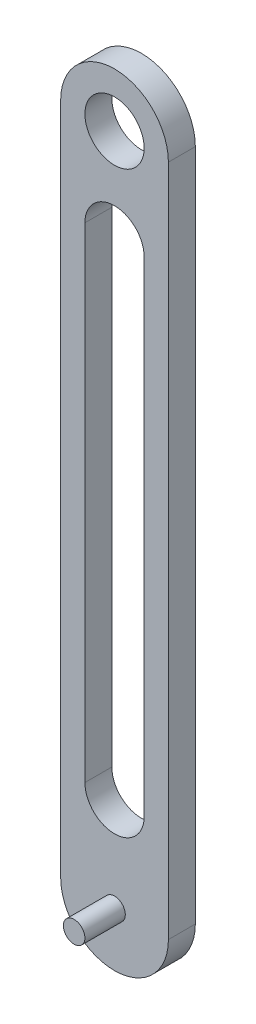
ISO-10303-21;
HEADER;
FILE_DESCRIPTION(('STEP AP214'),'2;1');
FILE_NAME('part.step','',(''),(''),'','','');
FILE_SCHEMA(('AUTOMOTIVE_DESIGN { 1 0 10303 214 1 1 1 1 }'));
ENDSEC;
DATA;
#1=APPLICATION_CONTEXT('core data for automotive mechanical design processes');
#2=APPLICATION_PROTOCOL_DEFINITION('international standard','automotive_design',2000,#1);
#3=PRODUCT_CONTEXT('',#1,'mechanical');
#4=PRODUCT('Part','Part','',(#3));
#5=PRODUCT_RELATED_PRODUCT_CATEGORY('part','',(#4));
#6=PRODUCT_DEFINITION_FORMATION('','',#4);
#7=PRODUCT_DEFINITION_CONTEXT('part definition',#1,'design');
#8=PRODUCT_DEFINITION('design','',#6,#7);
#9=PRODUCT_DEFINITION_SHAPE('','',#8);
#10=(LENGTH_UNIT() NAMED_UNIT(*) SI_UNIT(.MILLI.,.METRE.));
#11=(NAMED_UNIT(*) PLANE_ANGLE_UNIT() SI_UNIT($,.RADIAN.));
#12=(NAMED_UNIT(*) SI_UNIT($,.STERADIAN.) SOLID_ANGLE_UNIT());
#13=UNCERTAINTY_MEASURE_WITH_UNIT(LENGTH_MEASURE(1.E-05),#10,'distance_accuracy_value','');
#14=(GEOMETRIC_REPRESENTATION_CONTEXT(3) GLOBAL_UNCERTAINTY_ASSIGNED_CONTEXT((#13)) GLOBAL_UNIT_ASSIGNED_CONTEXT((#10,
#11,#12)) REPRESENTATION_CONTEXT('',''));
#15=CARTESIAN_POINT('',(0.,0.,0.));
#16=DIRECTION('',(0.,0.,1.));
#17=DIRECTION('',(1.,0.,0.));
#18=AXIS2_PLACEMENT_3D('',#15,#16,#17);
#19=CARTESIAN_POINT('',(-11.,0.,10.));
#20=DIRECTION('',(1.,0.,0.));
#21=DIRECTION('',(0.,1.,0.));
#22=AXIS2_PLACEMENT_3D('',#19,#20,#21);
#23=PLANE('',#22);
#24=DIRECTION('',(0.,-1.,0.));
#25=VECTOR('',#24,1.);
#26=CARTESIAN_POINT('',(-11.,0.,0.));
#27=LINE('',#26,#25);
#28=CARTESIAN_POINT('',(-11.,89.9999999999998,0.));
#29=VERTEX_POINT('',#28);
#30=CARTESIAN_POINT('',(-11.,-90.0000000000002,0.));
#31=VERTEX_POINT('',#30);
#32=EDGE_CURVE('E170',#29,#31,#27,.T.);
#33=ORIENTED_EDGE('',*,*,#32,.F.);
#34=DIRECTION('',(0.,0.,-1.));
#35=VECTOR('',#34,1.);
#36=CARTESIAN_POINT('',(-11.,89.9999999999998,10.));
#37=LINE('',#36,#35);
#38=CARTESIAN_POINT('',(-11.,89.9999999999998,10.));
#39=VERTEX_POINT('',#38);
#40=EDGE_CURVE('E11',#39,#29,#37,.T.);
#41=ORIENTED_EDGE('',*,*,#40,.F.);
#42=DIRECTION('',(0.,-1.,0.));
#43=VECTOR('',#42,1.);
#44=CARTESIAN_POINT('',(-11.,0.,10.));
#45=LINE('',#44,#43);
#46=CARTESIAN_POINT('',(-11.,-90.0000000000002,10.));
#47=VERTEX_POINT('',#46);
#48=EDGE_CURVE('E131',#39,#47,#45,.T.);
#49=ORIENTED_EDGE('',*,*,#48,.T.);
#50=DIRECTION('',(0.,0.,-1.));
#51=VECTOR('',#50,1.);
#52=CARTESIAN_POINT('',(-11.,-90.0000000000002,10.));
#53=LINE('',#52,#51);
#54=EDGE_CURVE('E63',#47,#31,#53,.T.);
#55=ORIENTED_EDGE('',*,*,#54,.T.);
#56=EDGE_LOOP('',(#33,#41,#49,#55));
#57=FACE_BOUND('',#56,.T.);
#58=ADVANCED_FACE('F43',(#57),#23,.T.);
#59=CARTESIAN_POINT('',(0.,89.9999999999998,10.));
#60=DIRECTION('',(0.,0.,-1.));
#61=DIRECTION('',(-1.,0.,0.));
#62=AXIS2_PLACEMENT_3D('',#59,#60,#61);
#63=CYLINDRICAL_SURFACE('',#62,11.);
#64=CARTESIAN_POINT('',(0.,89.9999999999998,0.));
#65=DIRECTION('',(0.,0.,1.));
#66=DIRECTION('',(1.,0.,0.));
#67=AXIS2_PLACEMENT_3D('',#64,#65,#66);
#68=CIRCLE('',#67,11.);
#69=CARTESIAN_POINT('',(11.,89.9999999999998,0.));
#70=VERTEX_POINT('',#69);
#71=EDGE_CURVE('E137',#29,#70,#68,.F.);
#72=ORIENTED_EDGE('',*,*,#71,.T.);
#73=DIRECTION('',(0.,0.,-1.));
#74=VECTOR('',#73,1.);
#75=CARTESIAN_POINT('',(11.,89.9999999999998,10.));
#76=LINE('',#75,#74);
#77=CARTESIAN_POINT('',(11.,89.9999999999998,10.));
#78=VERTEX_POINT('',#77);
#79=EDGE_CURVE('E54',#78,#70,#76,.T.);
#80=ORIENTED_EDGE('',*,*,#79,.F.);
#81=CARTESIAN_POINT('',(0.,89.9999999999998,10.));
#82=DIRECTION('',(0.,0.,1.));
#83=DIRECTION('',(1.,0.,0.));
#84=AXIS2_PLACEMENT_3D('',#81,#82,#83);
#85=CIRCLE('',#84,11.);
#86=EDGE_CURVE('E126',#39,#78,#85,.F.);
#87=ORIENTED_EDGE('',*,*,#86,.F.);
#88=ORIENTED_EDGE('',*,*,#40,.T.);
#89=EDGE_LOOP('',(#72,#80,#87,#88));
#90=FACE_BOUND('',#89,.T.);
#91=ADVANCED_FACE('F135',(#90),#63,.F.);
#92=CARTESIAN_POINT('',(11.,0.,10.));
#93=DIRECTION('',(1.,0.,0.));
#94=DIRECTION('',(0.,1.,0.));
#95=AXIS2_PLACEMENT_3D('',#92,#93,#94);
#96=PLANE('',#95);
#97=DIRECTION('',(0.,-1.,0.));
#98=VECTOR('',#97,1.);
#99=CARTESIAN_POINT('',(11.,0.,0.));
#100=LINE('',#99,#98);
#101=CARTESIAN_POINT('',(11.,-90.0000000000002,0.));
#102=VERTEX_POINT('',#101);
#103=EDGE_CURVE('E165',#70,#102,#100,.T.);
#104=ORIENTED_EDGE('',*,*,#103,.T.);
#105=DIRECTION('',(0.,0.,-1.));
#106=VECTOR('',#105,1.);
#107=CARTESIAN_POINT('',(11.,-90.0000000000002,10.));
#108=LINE('',#107,#106);
#109=CARTESIAN_POINT('',(11.,-90.0000000000002,10.));
#110=VERTEX_POINT('',#109);
#111=EDGE_CURVE('E89',#110,#102,#108,.T.);
#112=ORIENTED_EDGE('',*,*,#111,.F.);
#113=DIRECTION('',(0.,-1.,0.));
#114=VECTOR('',#113,1.);
#115=CARTESIAN_POINT('',(11.,0.,10.));
#116=LINE('',#115,#114);
#117=EDGE_CURVE('E117',#78,#110,#116,.T.);
#118=ORIENTED_EDGE('',*,*,#117,.F.);
#119=ORIENTED_EDGE('',*,*,#79,.T.);
#120=EDGE_LOOP('',(#104,#112,#118,#119));
#121=FACE_BOUND('',#120,.T.);
#122=ADVANCED_FACE('F119',(#121),#96,.F.);
#123=CARTESIAN_POINT('',(-20.,0.,10.));
#124=DIRECTION('',(1.,0.,0.));
#125=DIRECTION('',(0.,0.,-1.));
#126=AXIS2_PLACEMENT_3D('',#123,#124,#125);
#127=PLANE('',#126);
#128=DIRECTION('',(0.,-1.,0.));
#129=VECTOR('',#128,1.);
#130=CARTESIAN_POINT('',(-20.,0.,0.));
#131=LINE('',#130,#129);
#132=CARTESIAN_POINT('',(-20.,125.,0.));
#133=VERTEX_POINT('',#132);
#134=CARTESIAN_POINT('',(-20.,-125.,0.));
#135=VERTEX_POINT('',#134);
#136=EDGE_CURVE('E184',#133,#135,#131,.T.);
#137=ORIENTED_EDGE('',*,*,#136,.T.);
#138=DIRECTION('',(0.,0.,-1.));
#139=VECTOR('',#138,1.);
#140=CARTESIAN_POINT('',(-20.,-125.,10.));
#141=LINE('',#140,#139);
#142=CARTESIAN_POINT('',(-20.,-125.,10.));
#143=VERTEX_POINT('',#142);
#144=EDGE_CURVE('E47',#143,#135,#141,.T.);
#145=ORIENTED_EDGE('',*,*,#144,.F.);
#146=DIRECTION('',(0.,-1.,0.));
#147=VECTOR('',#146,1.);
#148=CARTESIAN_POINT('',(-20.,0.,10.));
#149=LINE('',#148,#147);
#150=CARTESIAN_POINT('',(-20.,125.,10.));
#151=VERTEX_POINT('',#150);
#152=EDGE_CURVE('E205',#151,#143,#149,.T.);
#153=ORIENTED_EDGE('',*,*,#152,.F.);
#154=DIRECTION('',(0.,0.,-1.));
#155=VECTOR('',#154,1.);
#156=CARTESIAN_POINT('',(-20.,125.,10.));
#157=LINE('',#156,#155);
#158=EDGE_CURVE('E144',#151,#133,#157,.T.);
#159=ORIENTED_EDGE('',*,*,#158,.T.);
#160=EDGE_LOOP('',(#137,#145,#153,#159));
#161=FACE_BOUND('',#160,.T.);
#162=ADVANCED_FACE('F251',(#161),#127,.F.);
#163=CARTESIAN_POINT('',(0.,-125.,10.));
#164=DIRECTION('',(0.,0.,-1.));
#165=DIRECTION('',(-1.,0.,0.));
#166=AXIS2_PLACEMENT_3D('',#163,#164,#165);
#167=CYLINDRICAL_SURFACE('',#166,20.);
#168=CARTESIAN_POINT('',(0.,-125.,0.));
#169=DIRECTION('',(0.,0.,1.));
#170=DIRECTION('',(1.,0.,0.));
#171=AXIS2_PLACEMENT_3D('',#168,#169,#170);
#172=CIRCLE('',#171,20.);
#173=CARTESIAN_POINT('',(20.,-125.,0.));
#174=VERTEX_POINT('',#173);
#175=EDGE_CURVE('E181',#135,#174,#172,.T.);
#176=ORIENTED_EDGE('',*,*,#175,.T.);
#177=DIRECTION('',(0.,0.,-1.));
#178=VECTOR('',#177,1.);
#179=CARTESIAN_POINT('',(20.,-125.,10.));
#180=LINE('',#179,#178);
#181=CARTESIAN_POINT('',(20.,-125.,10.));
#182=VERTEX_POINT('',#181);
#183=EDGE_CURVE('E149',#182,#174,#180,.T.);
#184=ORIENTED_EDGE('',*,*,#183,.F.);
#185=CARTESIAN_POINT('',(0.,-125.,10.));
#186=DIRECTION('',(0.,0.,1.));
#187=DIRECTION('',(1.,0.,0.));
#188=AXIS2_PLACEMENT_3D('',#185,#186,#187);
#189=CIRCLE('',#188,20.);
#190=EDGE_CURVE('E102',#143,#182,#189,.T.);
#191=ORIENTED_EDGE('',*,*,#190,.F.);
#192=ORIENTED_EDGE('',*,*,#144,.T.);
#193=EDGE_LOOP('',(#176,#184,#191,#192));
#194=FACE_BOUND('',#193,.T.);
#195=ADVANCED_FACE('F249',(#194),#167,.T.);
#196=CARTESIAN_POINT('',(20.,0.,10.));
#197=DIRECTION('',(1.,0.,0.));
#198=DIRECTION('',(0.,1.,0.));
#199=AXIS2_PLACEMENT_3D('',#196,#197,#198);
#200=PLANE('',#199);
#201=DIRECTION('',(0.,-1.,0.));
#202=VECTOR('',#201,1.);
#203=CARTESIAN_POINT('',(20.,0.,0.));
#204=LINE('',#203,#202);
#205=CARTESIAN_POINT('',(20.,125.,0.));
#206=VERTEX_POINT('',#205);
#207=EDGE_CURVE('E177',#206,#174,#204,.T.);
#208=ORIENTED_EDGE('',*,*,#207,.F.);
#209=DIRECTION('',(0.,0.,-1.));
#210=VECTOR('',#209,1.);
#211=CARTESIAN_POINT('',(20.,125.,10.));
#212=LINE('',#211,#210);
#213=CARTESIAN_POINT('',(20.,125.,10.));
#214=VERTEX_POINT('',#213);
#215=EDGE_CURVE('E147',#214,#206,#212,.T.);
#216=ORIENTED_EDGE('',*,*,#215,.F.);
#217=DIRECTION('',(0.,-1.,0.));
#218=VECTOR('',#217,1.);
#219=CARTESIAN_POINT('',(20.,0.,10.));
#220=LINE('',#219,#218);
#221=EDGE_CURVE('E200',#214,#182,#220,.T.);
#222=ORIENTED_EDGE('',*,*,#221,.T.);
#223=ORIENTED_EDGE('',*,*,#183,.T.);
#224=EDGE_LOOP('',(#208,#216,#222,#223));
#225=FACE_BOUND('',#224,.T.);
#226=ADVANCED_FACE('F245',(#225),#200,.T.);
#227=CARTESIAN_POINT('',(0.,125.,10.));
#228=DIRECTION('',(0.,0.,-1.));
#229=DIRECTION('',(-1.,0.,0.));
#230=AXIS2_PLACEMENT_3D('',#227,#228,#229);
#231=CYLINDRICAL_SURFACE('',#230,20.);
#232=CARTESIAN_POINT('',(0.,125.,0.));
#233=DIRECTION('',(0.,0.,1.));
#234=DIRECTION('',(1.,0.,0.));
#235=AXIS2_PLACEMENT_3D('',#232,#233,#234);
#236=CIRCLE('',#235,20.);
#237=EDGE_CURVE('E173',#133,#206,#236,.F.);
#238=ORIENTED_EDGE('',*,*,#237,.F.);
#239=ORIENTED_EDGE('',*,*,#158,.F.);
#240=CARTESIAN_POINT('',(0.,125.,10.));
#241=DIRECTION('',(0.,0.,1.));
#242=DIRECTION('',(1.,0.,0.));
#243=AXIS2_PLACEMENT_3D('',#240,#241,#242);
#244=CIRCLE('',#243,20.);
#245=EDGE_CURVE('E196',#151,#214,#244,.F.);
#246=ORIENTED_EDGE('',*,*,#245,.T.);
#247=ORIENTED_EDGE('',*,*,#215,.T.);
#248=EDGE_LOOP('',(#238,#239,#246,#247));
#249=FACE_BOUND('',#248,.T.);
#250=ADVANCED_FACE('F242',(#249),#231,.T.);
#251=CARTESIAN_POINT('',(0.,125.,10.));
#252=DIRECTION('',(0.,0.,-1.));
#253=DIRECTION('',(-1.,0.,0.));
#254=AXIS2_PLACEMENT_3D('',#251,#252,#253);
#255=CYLINDRICAL_SURFACE('',#254,11.);
#256=CARTESIAN_POINT('',(0.,125.,10.));
#257=DIRECTION('',(0.,0.,1.));
#258=DIRECTION('',(1.,0.,0.));
#259=AXIS2_PLACEMENT_3D('',#256,#257,#258);
#260=CIRCLE('',#259,11.);
#261=CARTESIAN_POINT('',(11.,125.,10.));
#262=VERTEX_POINT('',#261);
#263=EDGE_CURVE('E208',#262,#262,#260,.T.);
#264=ORIENTED_EDGE('',*,*,#263,.T.);
#265=EDGE_LOOP('',(#264));
#266=FACE_BOUND('',#265,.T.);
#267=CARTESIAN_POINT('',(0.,125.,0.));
#268=DIRECTION('',(0.,0.,1.));
#269=DIRECTION('',(1.,0.,0.));
#270=AXIS2_PLACEMENT_3D('',#267,#268,#269);
#271=CIRCLE('',#270,11.);
#272=CARTESIAN_POINT('',(11.,125.,0.));
#273=VERTEX_POINT('',#272);
#274=EDGE_CURVE('E187',#273,#273,#271,.T.);
#275=ORIENTED_EDGE('',*,*,#274,.F.);
#276=EDGE_LOOP('',(#275));
#277=FACE_BOUND('',#276,.T.);
#278=ADVANCED_FACE('F45',(#266,#277),#255,.F.);
#279=CARTESIAN_POINT('',(0.,-90.0000000000002,10.));
#280=DIRECTION('',(0.,0.,-1.));
#281=DIRECTION('',(-1.,0.,0.));
#282=AXIS2_PLACEMENT_3D('',#279,#280,#281);
#283=CYLINDRICAL_SURFACE('',#282,11.);
#284=CARTESIAN_POINT('',(0.,-90.0000000000002,0.));
#285=DIRECTION('',(0.,0.,1.));
#286=DIRECTION('',(1.,0.,0.));
#287=AXIS2_PLACEMENT_3D('',#284,#285,#286);
#288=CIRCLE('',#287,11.);
#289=EDGE_CURVE('E160',#31,#102,#288,.T.);
#290=ORIENTED_EDGE('',*,*,#289,.F.);
#291=ORIENTED_EDGE('',*,*,#54,.F.);
#292=CARTESIAN_POINT('',(0.,-90.0000000000002,10.));
#293=DIRECTION('',(0.,0.,1.));
#294=DIRECTION('',(1.,0.,0.));
#295=AXIS2_PLACEMENT_3D('',#292,#293,#294);
#296=CIRCLE('',#295,11.);
#297=EDGE_CURVE('E125',#47,#110,#296,.T.);
#298=ORIENTED_EDGE('',*,*,#297,.T.);
#299=ORIENTED_EDGE('',*,*,#111,.T.);
#300=EDGE_LOOP('',(#290,#291,#298,#299));
#301=FACE_BOUND('',#300,.T.);
#302=ADVANCED_FACE('F266',(#301),#283,.F.);
#303=CARTESIAN_POINT('',(0.,0.,10.));
#304=DIRECTION('',(0.,0.,1.));
#305=DIRECTION('',(1.,0.,0.));
#306=AXIS2_PLACEMENT_3D('',#303,#304,#305);
#307=PLANE('',#306);
#308=CARTESIAN_POINT('',(0.,-125.,10.));
#309=DIRECTION('',(0.,0.,1.));
#310=DIRECTION('',(1.,0.,0.));
#311=AXIS2_PLACEMENT_3D('',#308,#309,#310);
#312=CIRCLE('',#311,4.);
#313=CARTESIAN_POINT('',(4.00000000000002,-125.,10.));
#314=VERTEX_POINT('',#313);
#315=EDGE_CURVE('E164',#314,#314,#312,.T.);
#316=ORIENTED_EDGE('',*,*,#315,.F.);
#317=EDGE_LOOP('',(#316));
#318=FACE_BOUND('',#317,.T.);
#319=ORIENTED_EDGE('',*,*,#263,.F.);
#320=EDGE_LOOP('',(#319));
#321=FACE_BOUND('',#320,.T.);
#322=ORIENTED_EDGE('',*,*,#152,.T.);
#323=ORIENTED_EDGE('',*,*,#190,.T.);
#324=ORIENTED_EDGE('',*,*,#221,.F.);
#325=ORIENTED_EDGE('',*,*,#245,.F.);
#326=EDGE_LOOP('',(#322,#323,#324,#325));
#327=FACE_BOUND('',#326,.T.);
#328=ORIENTED_EDGE('',*,*,#48,.F.);
#329=ORIENTED_EDGE('',*,*,#86,.T.);
#330=ORIENTED_EDGE('',*,*,#117,.T.);
#331=ORIENTED_EDGE('',*,*,#297,.F.);
#332=EDGE_LOOP('',(#328,#329,#330,#331));
#333=FACE_BOUND('',#332,.T.);
#334=ADVANCED_FACE('F130',(#318,#321,#327,#333),#307,.T.);
#335=CARTESIAN_POINT('',(0.,0.,0.));
#336=DIRECTION('',(0.,0.,1.));
#337=DIRECTION('',(1.,0.,0.));
#338=AXIS2_PLACEMENT_3D('',#335,#336,#337);
#339=PLANE('',#338);
#340=ORIENTED_EDGE('',*,*,#274,.T.);
#341=EDGE_LOOP('',(#340));
#342=FACE_BOUND('',#341,.T.);
#343=ORIENTED_EDGE('',*,*,#136,.F.);
#344=ORIENTED_EDGE('',*,*,#237,.T.);
#345=ORIENTED_EDGE('',*,*,#207,.T.);
#346=ORIENTED_EDGE('',*,*,#175,.F.);
#347=EDGE_LOOP('',(#343,#344,#345,#346));
#348=FACE_BOUND('',#347,.T.);
#349=ORIENTED_EDGE('',*,*,#32,.T.);
#350=ORIENTED_EDGE('',*,*,#289,.T.);
#351=ORIENTED_EDGE('',*,*,#103,.F.);
#352=ORIENTED_EDGE('',*,*,#71,.F.);
#353=EDGE_LOOP('',(#349,#350,#351,#352));
#354=FACE_BOUND('',#353,.T.);
#355=ADVANCED_FACE('F223',(#342,#348,#354),#339,.F.);
#356=CARTESIAN_POINT('',(0.,-125.,25.));
#357=DIRECTION('',(0.,0.,-1.));
#358=DIRECTION('',(-1.,0.,0.));
#359=AXIS2_PLACEMENT_3D('',#356,#357,#358);
#360=CYLINDRICAL_SURFACE('',#359,4.);
#361=ORIENTED_EDGE('',*,*,#315,.T.);
#362=EDGE_LOOP('',(#361));
#363=FACE_BOUND('',#362,.T.);
#364=CARTESIAN_POINT('',(0.,-125.,25.));
#365=DIRECTION('',(0.,0.,1.));
#366=DIRECTION('',(1.,0.,0.));
#367=AXIS2_PLACEMENT_3D('',#364,#365,#366);
#368=CIRCLE('',#367,4.);
#369=CARTESIAN_POINT('',(4.00000000000002,-125.,25.));
#370=VERTEX_POINT('',#369);
#371=EDGE_CURVE('E191',#370,#370,#368,.T.);
#372=ORIENTED_EDGE('',*,*,#371,.F.);
#373=EDGE_LOOP('',(#372));
#374=FACE_BOUND('',#373,.T.);
#375=ADVANCED_FACE('F221',(#363,#374),#360,.T.);
#376=CARTESIAN_POINT('',(0.,0.,25.));
#377=DIRECTION('',(0.,0.,1.));
#378=DIRECTION('',(1.,0.,0.));
#379=AXIS2_PLACEMENT_3D('',#376,#377,#378);
#380=PLANE('',#379);
#381=ORIENTED_EDGE('',*,*,#371,.T.);
#382=EDGE_LOOP('',(#381));
#383=FACE_BOUND('',#382,.T.);
#384=ADVANCED_FACE('F219',(#383),#380,.T.);
#385=CLOSED_SHELL('',(#58,#91,#122,#162,#195,#226,#250,#278,#302,#334,#355,#375,#384));
#386=MANIFOLD_SOLID_BREP('B2',#385);
#387=ADVANCED_BREP_SHAPE_REPRESENTATION('',(#18,#386),#14);
#388=SHAPE_DEFINITION_REPRESENTATION(#9,#387);
ENDSEC;
END-ISO-10303-21;
